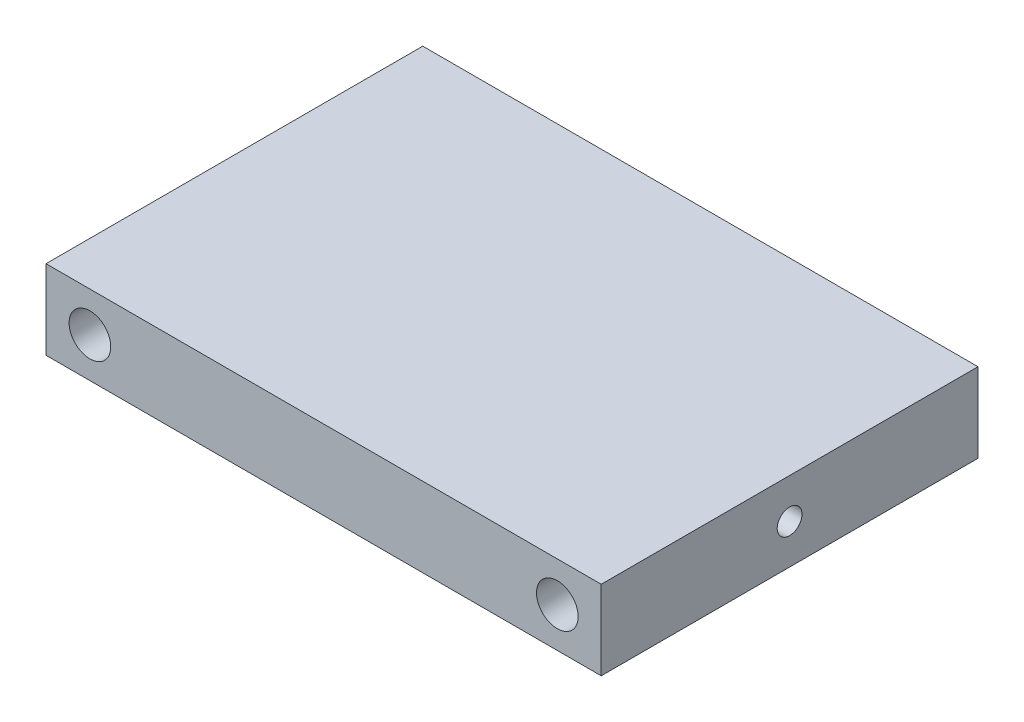
ISO-10303-21;
HEADER;
FILE_DESCRIPTION(('STEP AP214'),'2;1');
FILE_NAME('part.step','',(''),(''),'','','');
FILE_SCHEMA(('AUTOMOTIVE_DESIGN { 1 0 10303 214 1 1 1 1 }'));
ENDSEC;
DATA;
#1=APPLICATION_CONTEXT('core data for automotive mechanical design processes');
#2=APPLICATION_PROTOCOL_DEFINITION('international standard','automotive_design',2000,#1);
#3=PRODUCT_CONTEXT('',#1,'mechanical');
#4=PRODUCT('Part','Part','',(#3));
#5=PRODUCT_RELATED_PRODUCT_CATEGORY('part','',(#4));
#6=PRODUCT_DEFINITION_FORMATION('','',#4);
#7=PRODUCT_DEFINITION_CONTEXT('part definition',#1,'design');
#8=PRODUCT_DEFINITION('design','',#6,#7);
#9=PRODUCT_DEFINITION_SHAPE('','',#8);
#10=(LENGTH_UNIT() NAMED_UNIT(*) SI_UNIT(.MILLI.,.METRE.));
#11=(NAMED_UNIT(*) PLANE_ANGLE_UNIT() SI_UNIT($,.RADIAN.));
#12=(NAMED_UNIT(*) SI_UNIT($,.STERADIAN.) SOLID_ANGLE_UNIT());
#13=UNCERTAINTY_MEASURE_WITH_UNIT(LENGTH_MEASURE(1.E-05),#10,'distance_accuracy_value','');
#14=(GEOMETRIC_REPRESENTATION_CONTEXT(3) GLOBAL_UNCERTAINTY_ASSIGNED_CONTEXT((#13)) GLOBAL_UNIT_ASSIGNED_CONTEXT((#10,
#11,#12)) REPRESENTATION_CONTEXT('',''));
#15=CARTESIAN_POINT('',(0.,0.,0.));
#16=DIRECTION('',(0.,0.,1.));
#17=DIRECTION('',(1.,0.,0.));
#18=AXIS2_PLACEMENT_3D('',#15,#16,#17);
#19=CARTESIAN_POINT('',(0.,0.,38.));
#20=DIRECTION('',(1.,0.,0.));
#21=DIRECTION('',(0.,0.,-1.));
#22=AXIS2_PLACEMENT_3D('',#19,#20,#21);
#23=PLANE('',#22);
#24=DIRECTION('',(0.,-1.,0.));
#25=VECTOR('',#24,1.);
#26=CARTESIAN_POINT('',(0.,0.,0.));
#27=LINE('',#26,#25);
#28=CARTESIAN_POINT('',(0.,8.,0.));
#29=VERTEX_POINT('',#28);
#30=CARTESIAN_POINT('',(0.,0.,0.));
#31=VERTEX_POINT('',#30);
#32=EDGE_CURVE('E108',#29,#31,#27,.T.);
#33=ORIENTED_EDGE('',*,*,#32,.T.);
#34=DIRECTION('',(0.,0.,-1.));
#35=VECTOR('',#34,1.);
#36=CARTESIAN_POINT('',(0.,0.,38.));
#37=LINE('',#36,#35);
#38=CARTESIAN_POINT('',(0.,0.,38.));
#39=VERTEX_POINT('',#38);
#40=EDGE_CURVE('E11',#39,#31,#37,.T.);
#41=ORIENTED_EDGE('',*,*,#40,.F.);
#42=DIRECTION('',(0.,-1.,0.));
#43=VECTOR('',#42,1.);
#44=CARTESIAN_POINT('',(0.,0.,38.));
#45=LINE('',#44,#43);
#46=CARTESIAN_POINT('',(0.,8.,38.));
#47=VERTEX_POINT('',#46);
#48=EDGE_CURVE('E95',#47,#39,#45,.T.);
#49=ORIENTED_EDGE('',*,*,#48,.F.);
#50=DIRECTION('',(0.,0.,-1.));
#51=VECTOR('',#50,1.);
#52=CARTESIAN_POINT('',(0.,8.,38.));
#53=LINE('',#52,#51);
#54=EDGE_CURVE('E104',#47,#29,#53,.T.);
#55=ORIENTED_EDGE('',*,*,#54,.T.);
#56=EDGE_LOOP('',(#33,#41,#49,#55));
#57=FACE_BOUND('',#56,.T.);
#58=ADVANCED_FACE('F37',(#57),#23,.F.);
#59=CARTESIAN_POINT('',(0.,0.,38.));
#60=DIRECTION('',(0.,1.,0.));
#61=DIRECTION('',(0.,0.,1.));
#62=AXIS2_PLACEMENT_3D('',#59,#60,#61);
#63=PLANE('',#62);
#64=DIRECTION('',(1.,0.,0.));
#65=VECTOR('',#64,1.);
#66=CARTESIAN_POINT('',(0.,0.,0.));
#67=LINE('',#66,#65);
#68=CARTESIAN_POINT('',(56.,0.,0.));
#69=VERTEX_POINT('',#68);
#70=EDGE_CURVE('E99',#31,#69,#67,.T.);
#71=ORIENTED_EDGE('',*,*,#70,.T.);
#72=DIRECTION('',(0.,0.,-1.));
#73=VECTOR('',#72,1.);
#74=CARTESIAN_POINT('',(56.,0.,38.));
#75=LINE('',#74,#73);
#76=CARTESIAN_POINT('',(56.,0.,38.));
#77=VERTEX_POINT('',#76);
#78=EDGE_CURVE('E51',#77,#69,#75,.T.);
#79=ORIENTED_EDGE('',*,*,#78,.F.);
#80=DIRECTION('',(1.,0.,0.));
#81=VECTOR('',#80,1.);
#82=CARTESIAN_POINT('',(0.,0.,38.));
#83=LINE('',#82,#81);
#84=EDGE_CURVE('E90',#39,#77,#83,.T.);
#85=ORIENTED_EDGE('',*,*,#84,.F.);
#86=ORIENTED_EDGE('',*,*,#40,.T.);
#87=EDGE_LOOP('',(#71,#79,#85,#86));
#88=FACE_BOUND('',#87,.T.);
#89=ADVANCED_FACE('F98',(#88),#63,.F.);
#90=CARTESIAN_POINT('',(56.,0.,38.));
#91=DIRECTION('',(-1.,0.,0.));
#92=DIRECTION('',(0.,0.,1.));
#93=AXIS2_PLACEMENT_3D('',#90,#91,#92);
#94=PLANE('',#93);
#95=CARTESIAN_POINT('',(56.,4.,19.));
#96=DIRECTION('',(1.,0.,0.));
#97=DIRECTION('',(0.,0.,-1.));
#98=AXIS2_PLACEMENT_3D('',#95,#96,#97);
#99=CIRCLE('',#98,1.25);
#100=CARTESIAN_POINT('',(56.,4.,17.75));
#101=VERTEX_POINT('',#100);
#102=EDGE_CURVE('E173',#101,#101,#99,.T.);
#103=ORIENTED_EDGE('',*,*,#102,.F.);
#104=EDGE_LOOP('',(#103));
#105=FACE_BOUND('',#104,.T.);
#106=DIRECTION('',(0.,1.,0.));
#107=VECTOR('',#106,1.);
#108=CARTESIAN_POINT('',(56.,0.,0.));
#109=LINE('',#108,#107);
#110=CARTESIAN_POINT('',(56.,8.,0.));
#111=VERTEX_POINT('',#110);
#112=EDGE_CURVE('E77',#69,#111,#109,.T.);
#113=ORIENTED_EDGE('',*,*,#112,.T.);
#114=DIRECTION('',(0.,0.,-1.));
#115=VECTOR('',#114,1.);
#116=CARTESIAN_POINT('',(56.,8.,38.));
#117=LINE('',#116,#115);
#118=CARTESIAN_POINT('',(56.,8.,38.));
#119=VERTEX_POINT('',#118);
#120=EDGE_CURVE('E100',#119,#111,#117,.T.);
#121=ORIENTED_EDGE('',*,*,#120,.F.);
#122=DIRECTION('',(0.,1.,0.));
#123=VECTOR('',#122,1.);
#124=CARTESIAN_POINT('',(56.,0.,38.));
#125=LINE('',#124,#123);
#126=EDGE_CURVE('E93',#77,#119,#125,.T.);
#127=ORIENTED_EDGE('',*,*,#126,.F.);
#128=ORIENTED_EDGE('',*,*,#78,.T.);
#129=EDGE_LOOP('',(#113,#121,#127,#128));
#130=FACE_BOUND('',#129,.T.);
#131=ADVANCED_FACE('F102',(#105,#130),#94,.F.);
#132=CARTESIAN_POINT('',(0.,8.,38.));
#133=DIRECTION('',(0.,-1.,0.));
#134=DIRECTION('',(0.,0.,-1.));
#135=AXIS2_PLACEMENT_3D('',#132,#133,#134);
#136=PLANE('',#135);
#137=DIRECTION('',(-1.,0.,0.));
#138=VECTOR('',#137,1.);
#139=CARTESIAN_POINT('',(0.,8.,0.));
#140=LINE('',#139,#138);
#141=EDGE_CURVE('E83',#111,#29,#140,.T.);
#142=ORIENTED_EDGE('',*,*,#141,.T.);
#143=ORIENTED_EDGE('',*,*,#54,.F.);
#144=DIRECTION('',(-1.,0.,0.));
#145=VECTOR('',#144,1.);
#146=CARTESIAN_POINT('',(0.,8.,38.));
#147=LINE('',#146,#145);
#148=EDGE_CURVE('E60',#119,#47,#147,.T.);
#149=ORIENTED_EDGE('',*,*,#148,.F.);
#150=ORIENTED_EDGE('',*,*,#120,.T.);
#151=EDGE_LOOP('',(#142,#143,#149,#150));
#152=FACE_BOUND('',#151,.T.);
#153=ADVANCED_FACE('F160',(#152),#136,.F.);
#154=CARTESIAN_POINT('',(0.,0.,38.));
#155=DIRECTION('',(0.,0.,-1.));
#156=DIRECTION('',(-1.,0.,0.));
#157=AXIS2_PLACEMENT_3D('',#154,#155,#156);
#158=PLANE('',#157);
#159=CARTESIAN_POINT('',(4.43,4.,38.));
#160=DIRECTION('',(0.,0.,1.));
#161=DIRECTION('',(1.,0.,0.));
#162=AXIS2_PLACEMENT_3D('',#159,#160,#161);
#163=CIRCLE('',#162,2.1);
#164=CARTESIAN_POINT('',(6.53,4.,38.));
#165=VERTEX_POINT('',#164);
#166=EDGE_CURVE('E179',#165,#165,#163,.T.);
#167=ORIENTED_EDGE('',*,*,#166,.F.);
#168=EDGE_LOOP('',(#167));
#169=FACE_BOUND('',#168,.T.);
#170=CARTESIAN_POINT('',(51.57,4.,38.));
#171=DIRECTION('',(0.,0.,1.));
#172=DIRECTION('',(1.,0.,0.));
#173=AXIS2_PLACEMENT_3D('',#170,#171,#172);
#174=CIRCLE('',#173,2.1);
#175=CARTESIAN_POINT('',(53.67,4.,38.));
#176=VERTEX_POINT('',#175);
#177=EDGE_CURVE('E185',#176,#176,#174,.T.);
#178=ORIENTED_EDGE('',*,*,#177,.F.);
#179=EDGE_LOOP('',(#178));
#180=FACE_BOUND('',#179,.T.);
#181=ORIENTED_EDGE('',*,*,#48,.T.);
#182=ORIENTED_EDGE('',*,*,#84,.T.);
#183=ORIENTED_EDGE('',*,*,#126,.T.);
#184=ORIENTED_EDGE('',*,*,#148,.T.);
#185=EDGE_LOOP('',(#181,#182,#183,#184));
#186=FACE_BOUND('',#185,.T.);
#187=ADVANCED_FACE('F91',(#169,#180,#186),#158,.F.);
#188=CARTESIAN_POINT('',(0.,0.,0.));
#189=DIRECTION('',(0.,0.,-1.));
#190=DIRECTION('',(-1.,0.,0.));
#191=AXIS2_PLACEMENT_3D('',#188,#189,#190);
#192=PLANE('',#191);
#193=CARTESIAN_POINT('',(4.43,4.,0.));
#194=DIRECTION('',(0.,0.,1.));
#195=DIRECTION('',(1.,0.,0.));
#196=AXIS2_PLACEMENT_3D('',#193,#194,#195);
#197=CIRCLE('',#196,2.1);
#198=CARTESIAN_POINT('',(6.53,4.,0.));
#199=VERTEX_POINT('',#198);
#200=EDGE_CURVE('E111',#199,#199,#197,.T.);
#201=ORIENTED_EDGE('',*,*,#200,.T.);
#202=EDGE_LOOP('',(#201));
#203=FACE_BOUND('',#202,.T.);
#204=CARTESIAN_POINT('',(51.57,4.,0.));
#205=DIRECTION('',(0.,0.,1.));
#206=DIRECTION('',(1.,0.,0.));
#207=AXIS2_PLACEMENT_3D('',#204,#205,#206);
#208=CIRCLE('',#207,2.1);
#209=CARTESIAN_POINT('',(53.67,4.,0.));
#210=VERTEX_POINT('',#209);
#211=EDGE_CURVE('E182',#210,#210,#208,.T.);
#212=ORIENTED_EDGE('',*,*,#211,.T.);
#213=EDGE_LOOP('',(#212));
#214=FACE_BOUND('',#213,.T.);
#215=ORIENTED_EDGE('',*,*,#32,.F.);
#216=ORIENTED_EDGE('',*,*,#141,.F.);
#217=ORIENTED_EDGE('',*,*,#112,.F.);
#218=ORIENTED_EDGE('',*,*,#70,.F.);
#219=EDGE_LOOP('',(#215,#216,#217,#218));
#220=FACE_BOUND('',#219,.T.);
#221=ADVANCED_FACE('F143',(#203,#214,#220),#192,.T.);
#222=CARTESIAN_POINT('',(51.57,4.,0.));
#223=DIRECTION('',(0.,0.,1.));
#224=DIRECTION('',(1.,0.,0.));
#225=AXIS2_PLACEMENT_3D('',#222,#223,#224);
#226=CYLINDRICAL_SURFACE('',#225,2.1);
#227=CARTESIAN_POINT('',(53.67,4.,17.75));
#228=CARTESIAN_POINT('',(53.6699971621291,4.06402267754602,17.750003113959));
#229=CARTESIAN_POINT('',(53.6670401074821,4.12815258595653,17.7549532932624));
#230=CARTESIAN_POINT('',(53.6554931807638,4.25449005246558,17.7745033059266));
#231=CARTESIAN_POINT('',(53.6468888608192,4.31669225013442,17.7891278908929));
#232=CARTESIAN_POINT('',(53.6249194880602,4.43707154117481,17.8272110078314));
#233=CARTESIAN_POINT('',(53.6115780342559,4.49526690977183,17.8506257822069));
#234=CARTESIAN_POINT('',(53.5812750851427,4.6067229222507,17.9053558561011));
#235=CARTESIAN_POINT('',(53.5643145857445,4.65998491795679,17.9366689825347));
#236=CARTESIAN_POINT('',(53.5266952168812,4.76463359604843,18.0089494025964));
#237=CARTESIAN_POINT('',(53.5058534645902,4.81557214692848,18.0504685476793));
#238=CARTESIAN_POINT('',(53.4632076492309,4.91020043493589,18.1407448396979));
#239=CARTESIAN_POINT('',(53.4414023896251,4.95388081883709,18.1895111748299));
#240=CARTESIAN_POINT('',(53.3961825137914,5.03807660067336,18.2998041859838));
#241=CARTESIAN_POINT('',(53.3728896271574,5.07757997860757,18.3621601143409));
#242=CARTESIAN_POINT('',(53.3305895398386,5.14539465089145,18.4939938036946));
#243=CARTESIAN_POINT('',(53.3115754702044,5.17372393928513,18.5634598858225));
#244=CARTESIAN_POINT('',(53.2847306607855,5.21248373271033,18.6906611694585));
#245=CARTESIAN_POINT('',(53.2753151144209,5.22556989258969,18.7472514101466));
#246=CARTESIAN_POINT('',(53.2621010726127,5.2437545574258,18.8623170573317));
#247=CARTESIAN_POINT('',(53.2582957639735,5.24886275144712,18.9207900889525));
#248=CARTESIAN_POINT('',(53.2568625084161,5.25079855338487,19.0380592891798));
#249=CARTESIAN_POINT('',(53.2592460016359,5.24761082608099,19.0968558554484));
#250=CARTESIAN_POINT('',(53.2698479658205,5.23312335423551,19.2129149206636));
#251=CARTESIAN_POINT('',(53.2780707654028,5.22181759180896,19.2701762488562));
#252=CARTESIAN_POINT('',(53.2991024619348,5.19186017575499,19.3810993907488));
#253=CARTESIAN_POINT('',(53.3118587319803,5.1732925825183,19.4347944482703));
#254=CARTESIAN_POINT('',(53.3405778415245,5.12948602608814,19.538453044792));
#255=CARTESIAN_POINT('',(53.3565418647655,5.10424459899154,19.5884151968906));
#256=CARTESIAN_POINT('',(53.3932062705075,5.04278816280288,19.6923432784405));
#257=CARTESIAN_POINT('',(53.4142486847057,5.00543141633341,19.7455138462452));
#258=CARTESIAN_POINT('',(53.4568278348291,4.92305711528897,19.8453764679346));
#259=CARTESIAN_POINT('',(53.4783650188079,4.87803235943505,19.8920623563225));
#260=CARTESIAN_POINT('',(53.5229311610997,4.77437238096987,19.984006467305));
#261=CARTESIAN_POINT('',(53.5457696729653,4.71472055120672,20.0282233098721));
#262=CARTESIAN_POINT('',(53.5872699602929,4.58744476042849,20.1058726374671));
#263=CARTESIAN_POINT('',(53.6059340528739,4.51982525406501,20.1393111098781));
#264=CARTESIAN_POINT('',(53.6359058210556,4.38291043333766,20.1920173770811));
#265=CARTESIAN_POINT('',(53.6476096407174,4.31400305902602,20.212058678855));
#266=CARTESIAN_POINT('',(53.6640606468874,4.17299494772703,20.2400491850786));
#267=CARTESIAN_POINT('',(53.6688159118197,4.10089801960829,20.2480124319446));
#268=CARTESIAN_POINT('',(53.6706618752183,3.96599894056758,20.2511104251478));
#269=CARTESIAN_POINT('',(53.6686901070898,3.90323940989396,20.2478142857026));
#270=CARTESIAN_POINT('',(53.6592971447952,3.779329056798,20.2319512721272));
#271=CARTESIAN_POINT('',(53.6518760212691,3.7181782135329,20.2193845181718));
#272=CARTESIAN_POINT('',(53.6324859005289,3.60045132354509,20.1859711517895));
#273=CARTESIAN_POINT('',(53.6206194036119,3.54380467433263,20.1653107041378));
#274=CARTESIAN_POINT('',(53.5932879528057,3.43478509803863,20.1165133794057));
#275=CARTESIAN_POINT('',(53.5778222653148,3.3824130451662,20.0883749779718));
#276=CARTESIAN_POINT('',(53.5426690371522,3.27754262682753,20.0221508000522));
#277=CARTESIAN_POINT('',(53.5227096843004,3.22559775593735,19.9833347749878));
#278=CARTESIAN_POINT('',(53.4813829405935,3.12856257942057,19.8984760049947));
#279=CARTESIAN_POINT('',(53.4600139246582,3.08348039035804,19.8524248317382));
#280=CARTESIAN_POINT('',(53.4149456304903,2.99555340448023,19.7475615468736));
#281=CARTESIAN_POINT('',(53.3912959596932,2.95372381563136,19.6878712541924));
#282=CARTESIAN_POINT('',(53.3473414010442,2.88067946590693,19.5612047575036));
#283=CARTESIAN_POINT('',(53.3270328129363,2.8494529207831,19.4942367520025));
#284=CARTESIAN_POINT('',(53.2966150778204,2.80443568637567,19.3694877835425));
#285=CARTESIAN_POINT('',(53.2852501737153,2.78833521705296,19.3128495890049));
#286=CARTESIAN_POINT('',(53.267966306342,2.76422668452816,19.1970982309966));
#287=CARTESIAN_POINT('',(53.2620400086598,2.75620772130364,19.1379885134646));
#288=CARTESIAN_POINT('',(53.2565035297272,2.7487083963005,19.0187164628599));
#289=CARTESIAN_POINT('',(53.2569150404842,2.74925735949578,18.9585512190136));
#290=CARTESIAN_POINT('',(53.264042158721,2.75893036562208,18.8392815463511));
#291=CARTESIAN_POINT('',(53.2707613440134,2.76805927523736,18.7801777389903));
#292=CARTESIAN_POINT('',(53.2890946002077,2.79378848278249,18.6671745395075));
#293=CARTESIAN_POINT('',(53.3004880726455,2.81005410988094,18.6131607021722));
#294=CARTESIAN_POINT('',(53.3268262747357,2.84929669688103,18.508567496522));
#295=CARTESIAN_POINT('',(53.341772336504,2.87227617502085,18.4579894256871));
#296=CARTESIAN_POINT('',(53.3763362760832,2.92836934128806,18.3533506612289));
#297=CARTESIAN_POINT('',(53.396319170375,2.96249955140186,18.299956467932));
#298=CARTESIAN_POINT('',(53.4372908271031,3.03818926924917,18.1991255411993));
#299=CARTESIAN_POINT('',(53.4582804000697,3.07975483965477,18.1516937235336));
#300=CARTESIAN_POINT('',(53.5027749769698,3.17680177046673,18.0565189232052));
#301=CARTESIAN_POINT('',(53.5261591024339,3.23344302018131,18.0098906094788));
#302=CARTESIAN_POINT('',(53.5695228016455,3.35496897965295,17.9267579145794));
#303=CARTESIAN_POINT('',(53.5895012906958,3.41985630434628,17.8902567565965));
#304=CARTESIAN_POINT('',(53.6231969487814,3.55391986506512,17.8300784013069));
#305=CARTESIAN_POINT('',(53.6371126370351,3.62285945284927,17.8059889526662));
#306=CARTESIAN_POINT('',(53.6580013457776,3.76474517200243,17.7701768604142));
#307=CARTESIAN_POINT('',(53.6650007542871,3.83767494589334,17.7584072022207));
#308=CARTESIAN_POINT('',(53.6687441845487,3.92586524765443,17.7521111788053));
#309=CARTESIAN_POINT('',(53.6692143080304,3.94067537397722,17.751320381099));
#310=CARTESIAN_POINT('',(53.6698425488409,3.97032174546059,17.750264423774));
#311=CARTESIAN_POINT('',(53.6700006578873,3.98515799130404,17.7499992781088));
#312=CARTESIAN_POINT('',(53.67,4.,17.75));
#313=B_SPLINE_CURVE_WITH_KNOTS('',3,(#227,#228,#229,#230,#231,#232,#233,#234,#235,#236,#237,
#238,#239,#240,#241,#242,#243,#244,#245,#246,#247,#248,#249,#250,#251,#252,#253,#254,#255,#256,
#257,#258,#259,#260,#261,#262,#263,#264,#265,#266,#267,#268,#269,#270,#271,#272,#273,#274,#275,
#276,#277,#278,#279,#280,#281,#282,#283,#284,#285,#286,#287,#288,#289,#290,#291,#292,#293,#294,
#295,#296,#297,#298,#299,#300,#301,#302,#303,#304,#305,#306,#307,#308,#309,#310,#311,#312),
.UNSPECIFIED.,.T.,.F.,(4,2,2,2,2,2,2,2,2,2,2,2,2,2,2,2,2,2,2,2,2,2,2,2,2,2,2,2,2,2,2,2,2,2,2,2,
2,2,2,2,2,2,4),(0.,0.19200403348835,0.384501211905477,0.576052578501205,0.767551300666375,
0.973564827280629,1.17984180795211,1.41092071869248,1.64162598039172,1.81740097351441,
1.99296232530018,2.16884843709785,2.34486506774137,2.51890178389486,2.69300284234918,
2.89712747677769,3.10144487924793,3.33331300711943,3.5650521094106,3.78187668667185,
3.99844898148911,4.18614059402245,4.37382977355368,4.5574338854849,4.74107545318404,
4.94381872781188,5.14679995649729,5.37561800173834,5.6041808992293,5.78334284825229,
5.96226282586768,6.14179531701276,6.32142970338499,6.4934155213285,6.66546593088817,
6.86405919941865,7.0628151419771,7.2926990028577,7.52265594562416,7.74438189628259,
7.96525858040517,8.00976858842739,8.0542797779609),.UNSPECIFIED.);
#314=CARTESIAN_POINT('',(53.67,4.,17.75));
#315=VERTEX_POINT('',#314);
#316=EDGE_CURVE('E40',#315,#315,#313,.T.);
#317=ORIENTED_EDGE('',*,*,#316,.T.);
#318=EDGE_LOOP('',(#317));
#319=FACE_BOUND('',#318,.T.);
#320=CARTESIAN_POINT('',(49.47,4.,17.75));
#321=CARTESIAN_POINT('',(49.4700028378709,3.93597732245398,17.750003113959));
#322=CARTESIAN_POINT('',(49.4729598925179,3.87184741404347,17.7549532932624));
#323=CARTESIAN_POINT('',(49.4845068192362,3.74550994753442,17.7745033059266));
#324=CARTESIAN_POINT('',(49.4931111391808,3.68330774986558,17.7891278908929));
#325=CARTESIAN_POINT('',(49.5150805119398,3.56292845882519,17.8272110078314));
#326=CARTESIAN_POINT('',(49.5284219657441,3.50473309022818,17.8506257822069));
#327=CARTESIAN_POINT('',(49.5587249148573,3.39327707774931,17.9053558561011));
#328=CARTESIAN_POINT('',(49.5756854142556,3.34001508204321,17.9366689825347));
#329=CARTESIAN_POINT('',(49.6133047831188,3.23536640395157,18.0089494025964));
#330=CARTESIAN_POINT('',(49.6341465354098,3.18442785307152,18.0504685476793));
#331=CARTESIAN_POINT('',(49.6767923507691,3.08979956506411,18.1407448396979));
#332=CARTESIAN_POINT('',(49.6985976103749,3.04611918116292,18.1895111748299));
#333=CARTESIAN_POINT('',(49.7438174862086,2.96192339932665,18.2998041859838));
#334=CARTESIAN_POINT('',(49.7671103728426,2.92242002139243,18.3621601143409));
#335=CARTESIAN_POINT('',(49.8094104601615,2.85460534910855,18.4939938036946));
#336=CARTESIAN_POINT('',(49.8284245297956,2.82627606071487,18.5634598858225));
#337=CARTESIAN_POINT('',(49.8552693392145,2.78751626728967,18.6906611694585));
#338=CARTESIAN_POINT('',(49.8646848855791,2.77443010741031,18.7472514101465));
#339=CARTESIAN_POINT('',(49.8778989273873,2.7562454425742,18.8623170573317));
#340=CARTESIAN_POINT('',(49.8817042360265,2.75113724855288,18.9207900889525));
#341=CARTESIAN_POINT('',(49.8831374915839,2.74920144661513,19.0380592891798));
#342=CARTESIAN_POINT('',(49.8807539983641,2.75238917391901,19.0968558554484));
#343=CARTESIAN_POINT('',(49.8701520341795,2.76687664576449,19.2129149206636));
#344=CARTESIAN_POINT('',(49.8619292345972,2.77818240819104,19.2701762488562));
#345=CARTESIAN_POINT('',(49.8408975380652,2.80813982424501,19.3810993907487));
#346=CARTESIAN_POINT('',(49.8281412680198,2.8267074174817,19.4347944482703));
#347=CARTESIAN_POINT('',(49.7994221584755,2.87051397391185,19.538453044792));
#348=CARTESIAN_POINT('',(49.7834581352345,2.89575540100846,19.5884151968906));
#349=CARTESIAN_POINT('',(49.7467937294925,2.95721183719712,19.6923432784405));
#350=CARTESIAN_POINT('',(49.7257513152943,2.99456858366658,19.7455138462452));
#351=CARTESIAN_POINT('',(49.683172165171,3.07694288471102,19.8453764679346));
#352=CARTESIAN_POINT('',(49.6616349811921,3.12196764056494,19.8920623563225));
#353=CARTESIAN_POINT('',(49.6170688389003,3.22562761903012,19.984006467305));
#354=CARTESIAN_POINT('',(49.5942303270347,3.28527944879328,20.0282233098721));
#355=CARTESIAN_POINT('',(49.5527300397072,3.41255523957151,20.1058726374671));
#356=CARTESIAN_POINT('',(49.5340659471261,3.48017474593499,20.1393111098781));
#357=CARTESIAN_POINT('',(49.5040941789444,3.61708956666234,20.1920173770811));
#358=CARTESIAN_POINT('',(49.4923903592826,3.68599694097398,20.212058678855));
#359=CARTESIAN_POINT('',(49.4759393531126,3.82700505227297,20.2400491850786));
#360=CARTESIAN_POINT('',(49.4711840881803,3.8991019803917,20.2480124319446));
#361=CARTESIAN_POINT('',(49.4693381247818,4.03400105943241,20.2511104251478));
#362=CARTESIAN_POINT('',(49.4713098929103,4.09676059010603,20.2478142857026));
#363=CARTESIAN_POINT('',(49.4807028552048,4.22067094320199,20.2319512721272));
#364=CARTESIAN_POINT('',(49.4881239787309,4.2818217864671,20.2193845181718));
#365=CARTESIAN_POINT('',(49.5075140994712,4.3995486764549,20.1859711517895));
#366=CARTESIAN_POINT('',(49.5193805963881,4.45619532566736,20.1653107041378));
#367=CARTESIAN_POINT('',(49.5467120471943,4.56521490196136,20.1165133794057));
#368=CARTESIAN_POINT('',(49.5621777346852,4.6175869548338,20.0883749779718));
#369=CARTESIAN_POINT('',(49.5973309628478,4.72245737317246,20.0221508000522));
#370=CARTESIAN_POINT('',(49.6172903156996,4.77440224406265,19.9833347749878));
#371=CARTESIAN_POINT('',(49.6586170594065,4.87143742057943,19.8984760049947));
#372=CARTESIAN_POINT('',(49.6799860753418,4.91651960964196,19.8524248317382));
#373=CARTESIAN_POINT('',(49.7250543695097,5.00444659551976,19.7475615468736));
#374=CARTESIAN_POINT('',(49.7487040403068,5.04627618436864,19.6878712541924));
#375=CARTESIAN_POINT('',(49.7926585989558,5.11932053409307,19.5612047575036));
#376=CARTESIAN_POINT('',(49.8129671870637,5.1505470792169,19.4942367520025));
#377=CARTESIAN_POINT('',(49.8433849221796,5.19556431362433,19.3694877835426));
#378=CARTESIAN_POINT('',(49.8547498262848,5.21166478294704,19.3128495890049));
#379=CARTESIAN_POINT('',(49.872033693658,5.23577331547184,19.1970982309966));
#380=CARTESIAN_POINT('',(49.8779599913402,5.24379227869636,19.1379885134646));
#381=CARTESIAN_POINT('',(49.8834964702728,5.2512916036995,19.01871646286));
#382=CARTESIAN_POINT('',(49.8830849595158,5.25074264050422,18.9585512190136));
#383=CARTESIAN_POINT('',(49.875957841279,5.24106963437793,18.8392815463511));
#384=CARTESIAN_POINT('',(49.8692386559866,5.23194072476264,18.7801777389903));
#385=CARTESIAN_POINT('',(49.8509053997923,5.20621151721751,18.6671745395075));
#386=CARTESIAN_POINT('',(49.8395119273545,5.18994589011906,18.6131607021722));
#387=CARTESIAN_POINT('',(49.8131737252643,5.15070330311898,18.508567496522));
#388=CARTESIAN_POINT('',(49.798227663496,5.12772382497915,18.4579894256871));
#389=CARTESIAN_POINT('',(49.7636637239168,5.07163065871195,18.3533506612289));
#390=CARTESIAN_POINT('',(49.743680829625,5.03750044859814,18.299956467932));
#391=CARTESIAN_POINT('',(49.7027091728969,4.96181073075084,18.1991255411993));
#392=CARTESIAN_POINT('',(49.6817195999303,4.92024516034523,18.1516937235337));
#393=CARTESIAN_POINT('',(49.6372250230302,4.82319822953327,18.0565189232052));
#394=CARTESIAN_POINT('',(49.6138408975661,4.7665569798187,18.0098906094788));
#395=CARTESIAN_POINT('',(49.5704771983546,4.64503102034706,17.9267579145794));
#396=CARTESIAN_POINT('',(49.5504987093042,4.58014369565373,17.8902567565965));
#397=CARTESIAN_POINT('',(49.5168030512186,4.44608013493489,17.8300784013069));
#398=CARTESIAN_POINT('',(49.5028873629649,4.37714054715073,17.8059889526662));
#399=CARTESIAN_POINT('',(49.4819986542224,4.23525482799757,17.7701768604142));
#400=CARTESIAN_POINT('',(49.4749992457129,4.16232505410666,17.7584072022207));
#401=CARTESIAN_POINT('',(49.4712558154513,4.07413475234558,17.7521111788053));
#402=CARTESIAN_POINT('',(49.4707856919697,4.05932462602278,17.751320381099));
#403=CARTESIAN_POINT('',(49.4701574511591,4.02967825453941,17.750264423774));
#404=CARTESIAN_POINT('',(49.4699993421127,4.01484200869596,17.7499992781088));
#405=CARTESIAN_POINT('',(49.47,4.,17.75));
#406=B_SPLINE_CURVE_WITH_KNOTS('',3,(#320,#321,#322,#323,#324,#325,#326,#327,#328,#329,#330,
#331,#332,#333,#334,#335,#336,#337,#338,#339,#340,#341,#342,#343,#344,#345,#346,#347,#348,#349,
#350,#351,#352,#353,#354,#355,#356,#357,#358,#359,#360,#361,#362,#363,#364,#365,#366,#367,#368,
#369,#370,#371,#372,#373,#374,#375,#376,#377,#378,#379,#380,#381,#382,#383,#384,#385,#386,#387,
#388,#389,#390,#391,#392,#393,#394,#395,#396,#397,#398,#399,#400,#401,#402,#403,#404,#405),
.UNSPECIFIED.,.T.,.F.,(4,2,2,2,2,2,2,2,2,2,2,2,2,2,2,2,2,2,2,2,2,2,2,2,2,2,2,2,2,2,2,2,2,2,2,2,
2,2,2,2,2,2,4),(0.,0.192004033488351,0.384501211905477,0.576052578501198,0.767551300666375,
0.973564827280625,1.17984180795211,1.41092071869247,1.64162598039172,1.8174009735144,
1.99296232530017,2.16884843709784,2.34486506774136,2.51890178389485,2.69300284234917,
2.89712747677768,3.10144487924792,3.33331300711943,3.5650521094106,3.78187668667184,
3.9984489814891,4.18614059402244,4.37382977355367,4.55743388548489,4.74107545318403,
4.94381872781188,5.14679995649729,5.37561800173833,5.60418089922929,5.78334284825229,
5.96226282586767,6.14179531701275,6.32142970338499,6.4934155213285,6.66546593088817,
6.86405919941865,7.0628151419771,7.29269900285769,7.52265594562415,7.74438189628258,
7.96525858040517,8.00976858842739,8.0542797779609),.UNSPECIFIED.);
#407=CARTESIAN_POINT('',(49.47,4.,17.75));
#408=VERTEX_POINT('',#407);
#409=EDGE_CURVE('E116',#408,#408,#406,.T.);
#410=ORIENTED_EDGE('',*,*,#409,.T.);
#411=EDGE_LOOP('',(#410));
#412=FACE_BOUND('',#411,.T.);
#413=ORIENTED_EDGE('',*,*,#211,.F.);
#414=EDGE_LOOP('',(#413));
#415=FACE_BOUND('',#414,.T.);
#416=ORIENTED_EDGE('',*,*,#177,.T.);
#417=EDGE_LOOP('',(#416));
#418=FACE_BOUND('',#417,.T.);
#419=ADVANCED_FACE('F122',(#319,#412,#415,#418),#226,.F.);
#420=CARTESIAN_POINT('',(4.43,4.,0.));
#421=DIRECTION('',(0.,0.,1.));
#422=DIRECTION('',(1.,0.,0.));
#423=AXIS2_PLACEMENT_3D('',#420,#421,#422);
#424=CYLINDRICAL_SURFACE('',#423,2.1);
#425=ORIENTED_EDGE('',*,*,#200,.F.);
#426=EDGE_LOOP('',(#425));
#427=FACE_BOUND('',#426,.T.);
#428=ORIENTED_EDGE('',*,*,#166,.T.);
#429=EDGE_LOOP('',(#428));
#430=FACE_BOUND('',#429,.T.);
#431=ADVANCED_FACE('F133',(#427,#430),#424,.F.);
#432=CARTESIAN_POINT('',(36.,4.,19.));
#433=DIRECTION('',(1.,0.,0.));
#434=DIRECTION('',(0.,0.,-1.));
#435=AXIS2_PLACEMENT_3D('',#432,#433,#434);
#436=PLANE('',#435);
#437=CARTESIAN_POINT('',(36.,4.,19.));
#438=DIRECTION('',(1.,0.,0.));
#439=DIRECTION('',(0.,0.,-1.));
#440=AXIS2_PLACEMENT_3D('',#437,#438,#439);
#441=CIRCLE('',#440,1.25);
#442=CARTESIAN_POINT('',(36.,4.,17.75));
#443=VERTEX_POINT('',#442);
#444=EDGE_CURVE('E121',#443,#443,#441,.T.);
#445=ORIENTED_EDGE('',*,*,#444,.T.);
#446=EDGE_LOOP('',(#445));
#447=FACE_BOUND('',#446,.T.);
#448=ADVANCED_FACE('F132',(#447),#436,.T.);
#449=CARTESIAN_POINT('',(36.,4.,19.));
#450=DIRECTION('',(1.,0.,0.));
#451=DIRECTION('',(0.,0.,-1.));
#452=AXIS2_PLACEMENT_3D('',#449,#450,#451);
#453=CYLINDRICAL_SURFACE('',#452,1.25);
#454=ORIENTED_EDGE('',*,*,#444,.F.);
#455=EDGE_LOOP('',(#454));
#456=FACE_BOUND('',#455,.T.);
#457=ORIENTED_EDGE('',*,*,#409,.F.);
#458=EDGE_LOOP('',(#457));
#459=FACE_BOUND('',#458,.T.);
#460=ADVANCED_FACE('F130',(#456,#459),#453,.F.);
#461=ORIENTED_EDGE('',*,*,#102,.T.);
#462=EDGE_LOOP('',(#461));
#463=FACE_BOUND('',#462,.T.);
#464=ORIENTED_EDGE('',*,*,#316,.F.);
#465=EDGE_LOOP('',(#464));
#466=FACE_BOUND('',#465,.T.);
#467=ADVANCED_FACE('F126',(#463,#466),#453,.F.);
#468=CLOSED_SHELL('',(#58,#89,#131,#153,#187,#221,#419,#431,#448,#460,#467));
#469=MANIFOLD_SOLID_BREP('B2',#468);
#470=ADVANCED_BREP_SHAPE_REPRESENTATION('',(#18,#469),#14);
#471=SHAPE_DEFINITION_REPRESENTATION(#9,#470);
ENDSEC;
END-ISO-10303-21;
